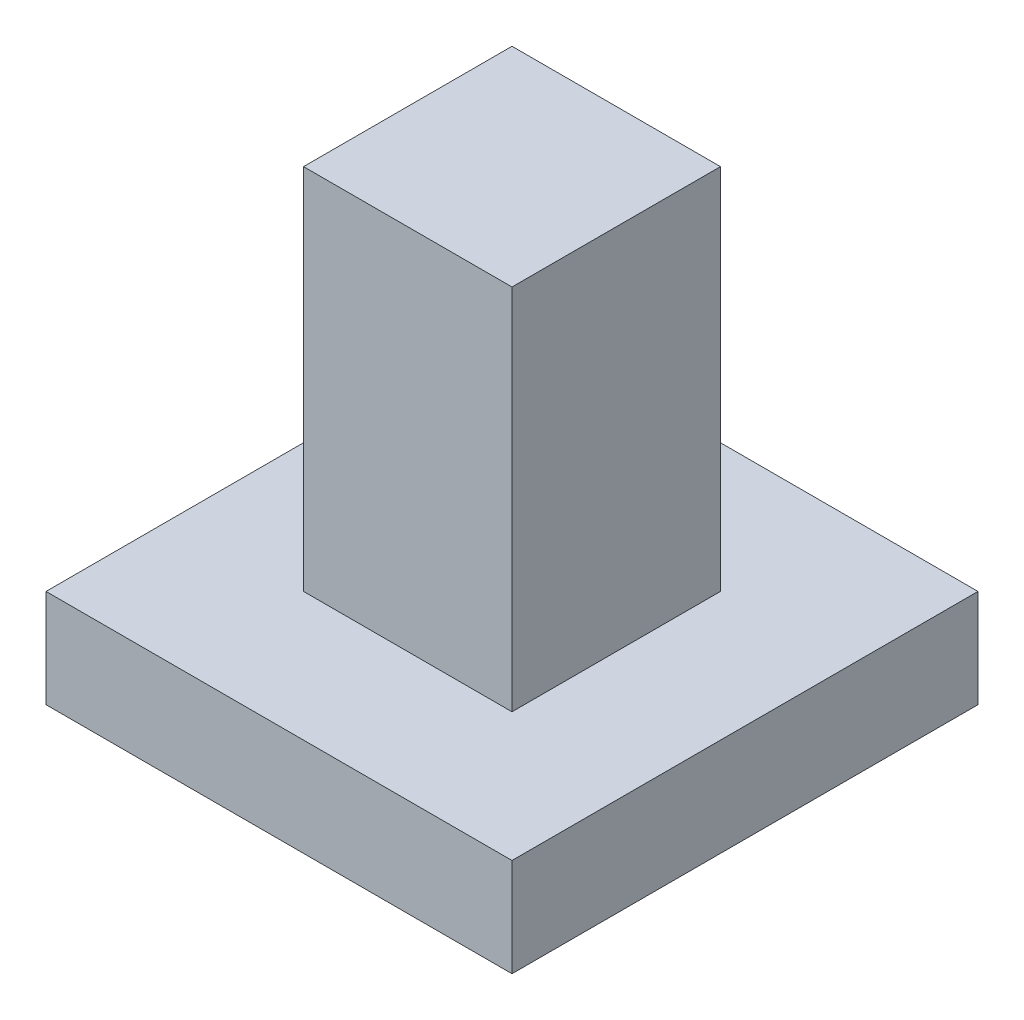
ISO-10303-21;
HEADER;
FILE_DESCRIPTION(('STEP AP214'),'2;1');
FILE_NAME('part.step','',(''),(''),'','','');
FILE_SCHEMA(('AUTOMOTIVE_DESIGN { 1 0 10303 214 1 1 1 1 }'));
ENDSEC;
DATA;
#1=APPLICATION_CONTEXT('core data for automotive mechanical design processes');
#2=APPLICATION_PROTOCOL_DEFINITION('international standard','automotive_design',2000,#1);
#3=PRODUCT_CONTEXT('',#1,'mechanical');
#4=PRODUCT('Part','Part','',(#3));
#5=PRODUCT_RELATED_PRODUCT_CATEGORY('part','',(#4));
#6=PRODUCT_DEFINITION_FORMATION('','',#4);
#7=PRODUCT_DEFINITION_CONTEXT('part definition',#1,'design');
#8=PRODUCT_DEFINITION('design','',#6,#7);
#9=PRODUCT_DEFINITION_SHAPE('','',#8);
#10=(LENGTH_UNIT() NAMED_UNIT(*) SI_UNIT(.MILLI.,.METRE.));
#11=(NAMED_UNIT(*) PLANE_ANGLE_UNIT() SI_UNIT($,.RADIAN.));
#12=(NAMED_UNIT(*) SI_UNIT($,.STERADIAN.) SOLID_ANGLE_UNIT());
#13=UNCERTAINTY_MEASURE_WITH_UNIT(LENGTH_MEASURE(1.E-05),#10,'distance_accuracy_value','');
#14=(GEOMETRIC_REPRESENTATION_CONTEXT(3) GLOBAL_UNCERTAINTY_ASSIGNED_CONTEXT((#13)) GLOBAL_UNIT_ASSIGNED_CONTEXT((#10,
#11,#12)) REPRESENTATION_CONTEXT('',''));
#15=CARTESIAN_POINT('',(0.,0.,0.));
#16=DIRECTION('',(0.,0.,1.));
#17=DIRECTION('',(1.,0.,0.));
#18=AXIS2_PLACEMENT_3D('',#15,#16,#17);
#19=CARTESIAN_POINT('',(0.,1.6,0.));
#20=DIRECTION('',(0.,1.,0.));
#21=DIRECTION('',(0.,0.,1.));
#22=AXIS2_PLACEMENT_3D('',#19,#20,#21);
#23=PLANE('',#22);
#24=DIRECTION('',(0.,0.,1.));
#25=VECTOR('',#24,1.);
#26=CARTESIAN_POINT('',(-7.6,1.6,-7.6));
#27=LINE('',#26,#25);
#28=CARTESIAN_POINT('',(-7.6,1.6,-7.6));
#29=VERTEX_POINT('',#28);
#30=CARTESIAN_POINT('',(-7.6,1.6,0.));
#31=VERTEX_POINT('',#30);
#32=EDGE_CURVE('E142',#29,#31,#27,.T.);
#33=ORIENTED_EDGE('',*,*,#32,.T.);
#34=DIRECTION('',(1.,0.,0.));
#35=VECTOR('',#34,1.);
#36=CARTESIAN_POINT('',(-7.6,1.6,0.));
#37=LINE('',#36,#35);
#38=CARTESIAN_POINT('',(0.,1.6,0.));
#39=VERTEX_POINT('',#38);
#40=EDGE_CURVE('E87',#31,#39,#37,.T.);
#41=ORIENTED_EDGE('',*,*,#40,.T.);
#42=DIRECTION('',(0.,0.,-1.));
#43=VECTOR('',#42,1.);
#44=CARTESIAN_POINT('',(0.,1.6,-7.6));
#45=LINE('',#44,#43);
#46=CARTESIAN_POINT('',(0.,1.6,-7.6));
#47=VERTEX_POINT('',#46);
#48=EDGE_CURVE('E145',#39,#47,#45,.T.);
#49=ORIENTED_EDGE('',*,*,#48,.T.);
#50=DIRECTION('',(-1.,0.,0.));
#51=VECTOR('',#50,1.);
#52=CARTESIAN_POINT('',(-7.6,1.6,-7.6));
#53=LINE('',#52,#51);
#54=EDGE_CURVE('E59',#47,#29,#53,.T.);
#55=ORIENTED_EDGE('',*,*,#54,.T.);
#56=EDGE_LOOP('',(#33,#41,#49,#55));
#57=FACE_BOUND('',#56,.T.);
#58=DIRECTION('',(-1.,0.,0.));
#59=VECTOR('',#58,1.);
#60=CARTESIAN_POINT('',(-2.1,1.6,-5.5));
#61=LINE('',#60,#59);
#62=CARTESIAN_POINT('',(-2.1,1.6,-5.5));
#63=VERTEX_POINT('',#62);
#64=CARTESIAN_POINT('',(-5.5,1.6,-5.5));
#65=VERTEX_POINT('',#64);
#66=EDGE_CURVE('E265',#63,#65,#61,.T.);
#67=ORIENTED_EDGE('',*,*,#66,.F.);
#68=DIRECTION('',(0.,0.,-1.));
#69=VECTOR('',#68,1.);
#70=CARTESIAN_POINT('',(-2.1,1.6,-2.1));
#71=LINE('',#70,#69);
#72=CARTESIAN_POINT('',(-2.1,1.6,-2.1));
#73=VERTEX_POINT('',#72);
#74=EDGE_CURVE('E132',#73,#63,#71,.T.);
#75=ORIENTED_EDGE('',*,*,#74,.F.);
#76=DIRECTION('',(1.,0.,0.));
#77=VECTOR('',#76,1.);
#78=CARTESIAN_POINT('',(-2.1,1.6,-2.1));
#79=LINE('',#78,#77);
#80=CARTESIAN_POINT('',(-5.5,1.6,-2.1));
#81=VERTEX_POINT('',#80);
#82=EDGE_CURVE('E128',#81,#73,#79,.T.);
#83=ORIENTED_EDGE('',*,*,#82,.F.);
#84=DIRECTION('',(0.,0.,1.));
#85=VECTOR('',#84,1.);
#86=CARTESIAN_POINT('',(-5.5,1.6,-2.1));
#87=LINE('',#86,#85);
#88=EDGE_CURVE('E262',#65,#81,#87,.T.);
#89=ORIENTED_EDGE('',*,*,#88,.F.);
#90=EDGE_LOOP('',(#67,#75,#83,#89));
#91=FACE_BOUND('',#90,.T.);
#92=ADVANCED_FACE('F35',(#57,#91),#23,.T.);
#93=CARTESIAN_POINT('',(-7.6,1.6,-7.6));
#94=DIRECTION('',(1.,0.,0.));
#95=DIRECTION('',(0.,0.,-1.));
#96=AXIS2_PLACEMENT_3D('',#93,#94,#95);
#97=PLANE('',#96);
#98=DIRECTION('',(0.,0.,1.));
#99=VECTOR('',#98,1.);
#100=CARTESIAN_POINT('',(-7.6,0.,-7.6));
#101=LINE('',#100,#99);
#102=CARTESIAN_POINT('',(-7.6,0.,-7.6));
#103=VERTEX_POINT('',#102);
#104=CARTESIAN_POINT('',(-7.6,0.,0.));
#105=VERTEX_POINT('',#104);
#106=EDGE_CURVE('E134',#103,#105,#101,.T.);
#107=ORIENTED_EDGE('',*,*,#106,.T.);
#108=DIRECTION('',(0.,-1.,0.));
#109=VECTOR('',#108,1.);
#110=CARTESIAN_POINT('',(-7.6,1.6,0.));
#111=LINE('',#110,#109);
#112=EDGE_CURVE('E11',#31,#105,#111,.T.);
#113=ORIENTED_EDGE('',*,*,#112,.F.);
#114=ORIENTED_EDGE('',*,*,#32,.F.);
#115=DIRECTION('',(0.,-1.,0.));
#116=VECTOR('',#115,1.);
#117=CARTESIAN_POINT('',(-7.6,1.6,-7.6));
#118=LINE('',#117,#116);
#119=EDGE_CURVE('E147',#29,#103,#118,.T.);
#120=ORIENTED_EDGE('',*,*,#119,.T.);
#121=EDGE_LOOP('',(#107,#113,#114,#120));
#122=FACE_BOUND('',#121,.T.);
#123=ADVANCED_FACE('F37',(#122),#97,.F.);
#124=CARTESIAN_POINT('',(-7.6,1.6,0.));
#125=DIRECTION('',(0.,0.,-1.));
#126=DIRECTION('',(-1.,0.,0.));
#127=AXIS2_PLACEMENT_3D('',#124,#125,#126);
#128=PLANE('',#127);
#129=DIRECTION('',(1.,0.,0.));
#130=VECTOR('',#129,1.);
#131=CARTESIAN_POINT('',(-7.6,0.,0.));
#132=LINE('',#131,#130);
#133=CARTESIAN_POINT('',(0.,0.,0.));
#134=VERTEX_POINT('',#133);
#135=EDGE_CURVE('E137',#105,#134,#132,.T.);
#136=ORIENTED_EDGE('',*,*,#135,.T.);
#137=DIRECTION('',(0.,-1.,0.));
#138=VECTOR('',#137,1.);
#139=CARTESIAN_POINT('',(0.,1.6,0.));
#140=LINE('',#139,#138);
#141=EDGE_CURVE('E43',#39,#134,#140,.T.);
#142=ORIENTED_EDGE('',*,*,#141,.F.);
#143=ORIENTED_EDGE('',*,*,#40,.F.);
#144=ORIENTED_EDGE('',*,*,#112,.T.);
#145=EDGE_LOOP('',(#136,#142,#143,#144));
#146=FACE_BOUND('',#145,.T.);
#147=ADVANCED_FACE('F175',(#146),#128,.F.);
#148=CARTESIAN_POINT('',(0.,1.6,-7.6));
#149=DIRECTION('',(-1.,0.,0.));
#150=DIRECTION('',(0.,0.,1.));
#151=AXIS2_PLACEMENT_3D('',#148,#149,#150);
#152=PLANE('',#151);
#153=DIRECTION('',(0.,0.,-1.));
#154=VECTOR('',#153,1.);
#155=CARTESIAN_POINT('',(0.,0.,-7.6));
#156=LINE('',#155,#154);
#157=CARTESIAN_POINT('',(0.,0.,-7.6));
#158=VERTEX_POINT('',#157);
#159=EDGE_CURVE('E150',#134,#158,#156,.T.);
#160=ORIENTED_EDGE('',*,*,#159,.T.);
#161=DIRECTION('',(0.,-1.,0.));
#162=VECTOR('',#161,1.);
#163=CARTESIAN_POINT('',(0.,1.6,-7.6));
#164=LINE('',#163,#162);
#165=EDGE_CURVE('E154',#47,#158,#164,.T.);
#166=ORIENTED_EDGE('',*,*,#165,.F.);
#167=ORIENTED_EDGE('',*,*,#48,.F.);
#168=ORIENTED_EDGE('',*,*,#141,.T.);
#169=EDGE_LOOP('',(#160,#166,#167,#168));
#170=FACE_BOUND('',#169,.T.);
#171=ADVANCED_FACE('F159',(#170),#152,.F.);
#172=CARTESIAN_POINT('',(-7.6,1.6,-7.6));
#173=DIRECTION('',(0.,0.,1.));
#174=DIRECTION('',(1.,0.,0.));
#175=AXIS2_PLACEMENT_3D('',#172,#173,#174);
#176=PLANE('',#175);
#177=DIRECTION('',(-1.,0.,0.));
#178=VECTOR('',#177,1.);
#179=CARTESIAN_POINT('',(-7.6,0.,-7.6));
#180=LINE('',#179,#178);
#181=EDGE_CURVE('E80',#158,#103,#180,.T.);
#182=ORIENTED_EDGE('',*,*,#181,.T.);
#183=ORIENTED_EDGE('',*,*,#119,.F.);
#184=ORIENTED_EDGE('',*,*,#54,.F.);
#185=ORIENTED_EDGE('',*,*,#165,.T.);
#186=EDGE_LOOP('',(#182,#183,#184,#185));
#187=FACE_BOUND('',#186,.T.);
#188=ADVANCED_FACE('F167',(#187),#176,.F.);
#189=CARTESIAN_POINT('',(0.,0.,0.));
#190=DIRECTION('',(0.,1.,0.));
#191=DIRECTION('',(0.,0.,1.));
#192=AXIS2_PLACEMENT_3D('',#189,#190,#191);
#193=PLANE('',#192);
#194=ORIENTED_EDGE('',*,*,#106,.F.);
#195=ORIENTED_EDGE('',*,*,#181,.F.);
#196=ORIENTED_EDGE('',*,*,#159,.F.);
#197=ORIENTED_EDGE('',*,*,#135,.F.);
#198=EDGE_LOOP('',(#194,#195,#196,#197));
#199=FACE_BOUND('',#198,.T.);
#200=ADVANCED_FACE('F163',(#199),#193,.F.);
#201=CARTESIAN_POINT('',(-2.1,7.6,-2.1));
#202=DIRECTION('',(-1.,0.,0.));
#203=DIRECTION('',(0.,0.,1.));
#204=AXIS2_PLACEMENT_3D('',#201,#202,#203);
#205=PLANE('',#204);
#206=ORIENTED_EDGE('',*,*,#74,.T.);
#207=DIRECTION('',(0.,-1.,0.));
#208=VECTOR('',#207,1.);
#209=CARTESIAN_POINT('',(-2.1,7.6,-5.5));
#210=LINE('',#209,#208);
#211=CARTESIAN_POINT('',(-2.1,7.6,-5.5));
#212=VERTEX_POINT('',#211);
#213=EDGE_CURVE('E113',#212,#63,#210,.T.);
#214=ORIENTED_EDGE('',*,*,#213,.F.);
#215=DIRECTION('',(0.,0.,-1.));
#216=VECTOR('',#215,1.);
#217=CARTESIAN_POINT('',(-2.1,7.6,-2.1));
#218=LINE('',#217,#216);
#219=CARTESIAN_POINT('',(-2.1,7.6,-2.1));
#220=VERTEX_POINT('',#219);
#221=EDGE_CURVE('E120',#220,#212,#218,.T.);
#222=ORIENTED_EDGE('',*,*,#221,.F.);
#223=DIRECTION('',(0.,-1.,0.));
#224=VECTOR('',#223,1.);
#225=CARTESIAN_POINT('',(-2.1,7.6,-2.1));
#226=LINE('',#225,#224);
#227=EDGE_CURVE('E260',#220,#73,#226,.T.);
#228=ORIENTED_EDGE('',*,*,#227,.T.);
#229=EDGE_LOOP('',(#206,#214,#222,#228));
#230=FACE_BOUND('',#229,.T.);
#231=ADVANCED_FACE('F130',(#230),#205,.F.);
#232=CARTESIAN_POINT('',(-2.1,7.6,-5.5));
#233=DIRECTION('',(0.,0.,1.));
#234=DIRECTION('',(1.,0.,0.));
#235=AXIS2_PLACEMENT_3D('',#232,#233,#234);
#236=PLANE('',#235);
#237=ORIENTED_EDGE('',*,*,#66,.T.);
#238=DIRECTION('',(0.,-1.,0.));
#239=VECTOR('',#238,1.);
#240=CARTESIAN_POINT('',(-5.5,7.6,-5.5));
#241=LINE('',#240,#239);
#242=CARTESIAN_POINT('',(-5.5,7.6,-5.5));
#243=VERTEX_POINT('',#242);
#244=EDGE_CURVE('E116',#243,#65,#241,.T.);
#245=ORIENTED_EDGE('',*,*,#244,.F.);
#246=DIRECTION('',(-1.,0.,0.));
#247=VECTOR('',#246,1.);
#248=CARTESIAN_POINT('',(-2.1,7.6,-5.5));
#249=LINE('',#248,#247);
#250=EDGE_CURVE('E109',#212,#243,#249,.T.);
#251=ORIENTED_EDGE('',*,*,#250,.F.);
#252=ORIENTED_EDGE('',*,*,#213,.T.);
#253=EDGE_LOOP('',(#237,#245,#251,#252));
#254=FACE_BOUND('',#253,.T.);
#255=ADVANCED_FACE('F111',(#254),#236,.F.);
#256=CARTESIAN_POINT('',(-5.5,7.6,-2.1));
#257=DIRECTION('',(1.,0.,0.));
#258=DIRECTION('',(0.,0.,-1.));
#259=AXIS2_PLACEMENT_3D('',#256,#257,#258);
#260=PLANE('',#259);
#261=ORIENTED_EDGE('',*,*,#88,.T.);
#262=DIRECTION('',(0.,-1.,0.));
#263=VECTOR('',#262,1.);
#264=CARTESIAN_POINT('',(-5.5,7.6,-2.1));
#265=LINE('',#264,#263);
#266=CARTESIAN_POINT('',(-5.5,7.6,-2.1));
#267=VERTEX_POINT('',#266);
#268=EDGE_CURVE('E50',#267,#81,#265,.T.);
#269=ORIENTED_EDGE('',*,*,#268,.F.);
#270=DIRECTION('',(0.,0.,1.));
#271=VECTOR('',#270,1.);
#272=CARTESIAN_POINT('',(-5.5,7.6,-2.1));
#273=LINE('',#272,#271);
#274=EDGE_CURVE('E119',#243,#267,#273,.T.);
#275=ORIENTED_EDGE('',*,*,#274,.F.);
#276=ORIENTED_EDGE('',*,*,#244,.T.);
#277=EDGE_LOOP('',(#261,#269,#275,#276));
#278=FACE_BOUND('',#277,.T.);
#279=ADVANCED_FACE('F188',(#278),#260,.F.);
#280=CARTESIAN_POINT('',(-2.1,7.6,-2.1));
#281=DIRECTION('',(0.,0.,-1.));
#282=DIRECTION('',(-1.,0.,0.));
#283=AXIS2_PLACEMENT_3D('',#280,#281,#282);
#284=PLANE('',#283);
#285=ORIENTED_EDGE('',*,*,#82,.T.);
#286=ORIENTED_EDGE('',*,*,#227,.F.);
#287=DIRECTION('',(1.,0.,0.));
#288=VECTOR('',#287,1.);
#289=CARTESIAN_POINT('',(-2.1,7.6,-2.1));
#290=LINE('',#289,#288);
#291=EDGE_CURVE('E124',#267,#220,#290,.T.);
#292=ORIENTED_EDGE('',*,*,#291,.F.);
#293=ORIENTED_EDGE('',*,*,#268,.T.);
#294=EDGE_LOOP('',(#285,#286,#292,#293));
#295=FACE_BOUND('',#294,.T.);
#296=ADVANCED_FACE('F191',(#295),#284,.F.);
#297=CARTESIAN_POINT('',(0.,7.6,0.));
#298=DIRECTION('',(0.,1.,0.));
#299=DIRECTION('',(0.,0.,1.));
#300=AXIS2_PLACEMENT_3D('',#297,#298,#299);
#301=PLANE('',#300);
#302=ORIENTED_EDGE('',*,*,#221,.T.);
#303=ORIENTED_EDGE('',*,*,#250,.T.);
#304=ORIENTED_EDGE('',*,*,#274,.T.);
#305=ORIENTED_EDGE('',*,*,#291,.T.);
#306=EDGE_LOOP('',(#302,#303,#304,#305));
#307=FACE_BOUND('',#306,.T.);
#308=ADVANCED_FACE('F123',(#307),#301,.T.);
#309=CLOSED_SHELL('',(#92,#123,#147,#171,#188,#200,#231,#255,#279,#296,#308));
#310=MANIFOLD_SOLID_BREP('B2',#309);
#311=ADVANCED_BREP_SHAPE_REPRESENTATION('',(#18,#310),#14);
#312=SHAPE_DEFINITION_REPRESENTATION(#9,#311);
ENDSEC;
END-ISO-10303-21;
